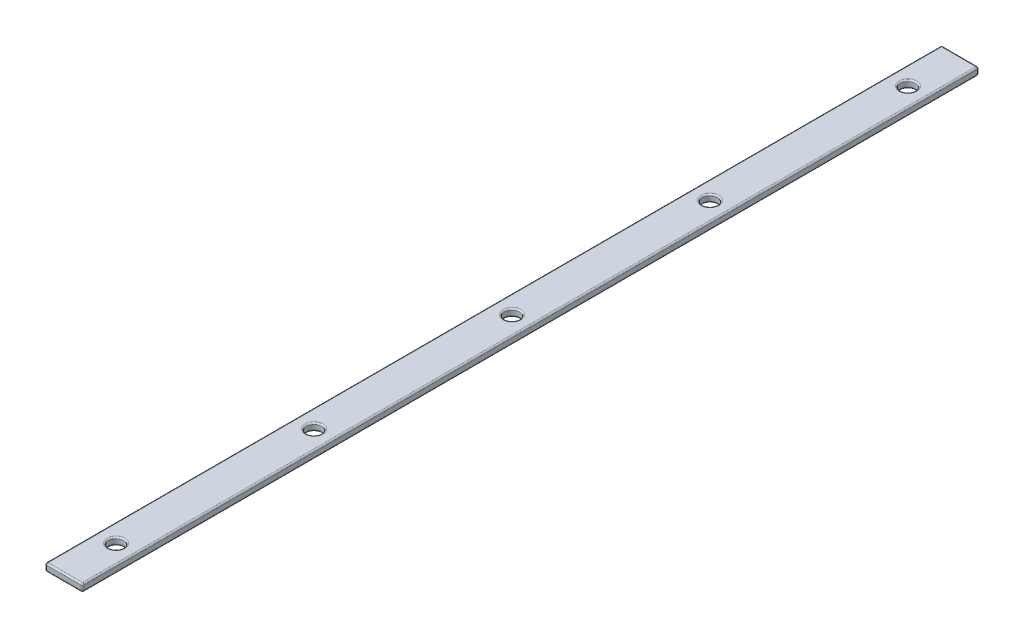
ISO-10303-21;
HEADER;
FILE_DESCRIPTION(('STEP AP214'),'2;1');
FILE_NAME('part.step','',(''),(''),'','','');
FILE_SCHEMA(('AUTOMOTIVE_DESIGN { 1 0 10303 214 1 1 1 1 }'));
ENDSEC;
DATA;
#1=APPLICATION_CONTEXT('core data for automotive mechanical design processes');
#2=APPLICATION_PROTOCOL_DEFINITION('international standard','automotive_design',2000,#1);
#3=PRODUCT_CONTEXT('',#1,'mechanical');
#4=PRODUCT('Part','Part','',(#3));
#5=PRODUCT_RELATED_PRODUCT_CATEGORY('part','',(#4));
#6=PRODUCT_DEFINITION_FORMATION('','',#4);
#7=PRODUCT_DEFINITION_CONTEXT('part definition',#1,'design');
#8=PRODUCT_DEFINITION('design','',#6,#7);
#9=PRODUCT_DEFINITION_SHAPE('','',#8);
#10=(LENGTH_UNIT() NAMED_UNIT(*) SI_UNIT(.MILLI.,.METRE.));
#11=(NAMED_UNIT(*) PLANE_ANGLE_UNIT() SI_UNIT($,.RADIAN.));
#12=(NAMED_UNIT(*) SI_UNIT($,.STERADIAN.) SOLID_ANGLE_UNIT());
#13=UNCERTAINTY_MEASURE_WITH_UNIT(LENGTH_MEASURE(1.E-05),#10,'distance_accuracy_value','');
#14=(GEOMETRIC_REPRESENTATION_CONTEXT(3) GLOBAL_UNCERTAINTY_ASSIGNED_CONTEXT((#13)) GLOBAL_UNIT_ASSIGNED_CONTEXT((#10,
#11,#12)) REPRESENTATION_CONTEXT('',''));
#15=CARTESIAN_POINT('',(0.,0.,0.));
#16=DIRECTION('',(0.,0.,1.));
#17=DIRECTION('',(1.,0.,0.));
#18=AXIS2_PLACEMENT_3D('',#15,#16,#17);
#19=CARTESIAN_POINT('',(0.,10.,0.));
#20=DIRECTION('',(0.,-1.,0.));
#21=DIRECTION('',(0.,0.,-1.));
#22=AXIS2_PLACEMENT_3D('',#19,#20,#21);
#23=PLANE('',#22);
#24=CARTESIAN_POINT('',(0.,10.,530.));
#25=DIRECTION('',(0.,-1.,0.));
#26=DIRECTION('',(0.,0.,-1.));
#27=AXIS2_PLACEMENT_3D('',#24,#25,#26);
#28=CIRCLE('',#27,12.);
#29=CARTESIAN_POINT('',(0.,10.,518.));
#30=VERTEX_POINT('',#29);
#31=EDGE_CURVE('E184',#30,#30,#28,.T.);
#32=ORIENTED_EDGE('',*,*,#31,.T.);
#33=EDGE_LOOP('',(#32));
#34=FACE_BOUND('',#33,.T.);
#35=CARTESIAN_POINT('',(0.,10.,265.));
#36=DIRECTION('',(0.,-1.,0.));
#37=DIRECTION('',(0.,0.,-1.));
#38=AXIS2_PLACEMENT_3D('',#35,#36,#37);
#39=CIRCLE('',#38,12.);
#40=CARTESIAN_POINT('',(0.,10.,253.));
#41=VERTEX_POINT('',#40);
#42=EDGE_CURVE('E181',#41,#41,#39,.T.);
#43=ORIENTED_EDGE('',*,*,#42,.T.);
#44=EDGE_LOOP('',(#43));
#45=FACE_BOUND('',#44,.T.);
#46=CARTESIAN_POINT('',(0.,10.,-530.));
#47=DIRECTION('',(0.,-1.,0.));
#48=DIRECTION('',(0.,0.,-1.));
#49=AXIS2_PLACEMENT_3D('',#46,#47,#48);
#50=CIRCLE('',#49,12.);
#51=CARTESIAN_POINT('',(0.,10.,-542.));
#52=VERTEX_POINT('',#51);
#53=EDGE_CURVE('E178',#52,#52,#50,.T.);
#54=ORIENTED_EDGE('',*,*,#53,.T.);
#55=EDGE_LOOP('',(#54));
#56=FACE_BOUND('',#55,.T.);
#57=CARTESIAN_POINT('',(0.,10.,0.));
#58=DIRECTION('',(0.,-1.,0.));
#59=DIRECTION('',(0.,0.,-1.));
#60=AXIS2_PLACEMENT_3D('',#57,#58,#59);
#61=CIRCLE('',#60,12.);
#62=CARTESIAN_POINT('',(0.,10.,-12.));
#63=VERTEX_POINT('',#62);
#64=EDGE_CURVE('E171',#63,#63,#61,.T.);
#65=ORIENTED_EDGE('',*,*,#64,.T.);
#66=EDGE_LOOP('',(#65));
#67=FACE_BOUND('',#66,.T.);
#68=CARTESIAN_POINT('',(0.,10.,-265.));
#69=DIRECTION('',(0.,-1.,0.));
#70=DIRECTION('',(0.,0.,-1.));
#71=AXIS2_PLACEMENT_3D('',#68,#69,#70);
#72=CIRCLE('',#71,12.);
#73=CARTESIAN_POINT('',(0.,10.,-277.));
#74=VERTEX_POINT('',#73);
#75=EDGE_CURVE('E168',#74,#74,#72,.T.);
#76=ORIENTED_EDGE('',*,*,#75,.T.);
#77=EDGE_LOOP('',(#76));
#78=FACE_BOUND('',#77,.T.);
#79=DIRECTION('',(0.,0.,1.));
#80=VECTOR('',#79,1.);
#81=CARTESIAN_POINT('',(-23.,10.,0.));
#82=LINE('',#81,#80);
#83=CARTESIAN_POINT('',(-23.,10.,-598.));
#84=VERTEX_POINT('',#83);
#85=CARTESIAN_POINT('',(-23.,10.,598.));
#86=VERTEX_POINT('',#85);
#87=EDGE_CURVE('E167',#84,#86,#82,.T.);
#88=ORIENTED_EDGE('',*,*,#87,.T.);
#89=DIRECTION('',(1.,0.,0.));
#90=VECTOR('',#89,1.);
#91=CARTESIAN_POINT('',(0.,10.,598.));
#92=LINE('',#91,#90);
#93=CARTESIAN_POINT('',(23.,10.,598.));
#94=VERTEX_POINT('',#93);
#95=EDGE_CURVE('E147',#86,#94,#92,.T.);
#96=ORIENTED_EDGE('',*,*,#95,.T.);
#97=DIRECTION('',(0.,0.,-1.));
#98=VECTOR('',#97,1.);
#99=CARTESIAN_POINT('',(23.,10.,0.));
#100=LINE('',#99,#98);
#101=CARTESIAN_POINT('',(23.,10.,-598.));
#102=VERTEX_POINT('',#101);
#103=EDGE_CURVE('E156',#94,#102,#100,.T.);
#104=ORIENTED_EDGE('',*,*,#103,.T.);
#105=DIRECTION('',(-1.,0.,0.));
#106=VECTOR('',#105,1.);
#107=CARTESIAN_POINT('',(0.,10.,-598.));
#108=LINE('',#107,#106);
#109=EDGE_CURVE('E162',#102,#84,#108,.T.);
#110=ORIENTED_EDGE('',*,*,#109,.T.);
#111=EDGE_LOOP('',(#88,#96,#104,#110));
#112=FACE_BOUND('',#111,.T.);
#113=ADVANCED_FACE('F37',(#34,#45,#56,#67,#78,#112),#23,.F.);
#114=CARTESIAN_POINT('',(0.,0.,0.));
#115=DIRECTION('',(0.,-1.,0.));
#116=DIRECTION('',(0.,0.,-1.));
#117=AXIS2_PLACEMENT_3D('',#114,#115,#116);
#118=PLANE('',#117);
#119=CARTESIAN_POINT('',(0.,0.,530.));
#120=DIRECTION('',(0.,-1.,0.));
#121=DIRECTION('',(0.,0.,-1.));
#122=AXIS2_PLACEMENT_3D('',#119,#120,#121);
#123=CIRCLE('',#122,12.);
#124=CARTESIAN_POINT('',(0.,0.,518.));
#125=VERTEX_POINT('',#124);
#126=EDGE_CURVE('E152',#125,#125,#123,.F.);
#127=ORIENTED_EDGE('',*,*,#126,.T.);
#128=EDGE_LOOP('',(#127));
#129=FACE_BOUND('',#128,.T.);
#130=CARTESIAN_POINT('',(0.,0.,-530.));
#131=DIRECTION('',(0.,-1.,0.));
#132=DIRECTION('',(0.,0.,-1.));
#133=AXIS2_PLACEMENT_3D('',#130,#131,#132);
#134=CIRCLE('',#133,12.);
#135=CARTESIAN_POINT('',(0.,0.,-542.));
#136=VERTEX_POINT('',#135);
#137=EDGE_CURVE('E251',#136,#136,#134,.F.);
#138=ORIENTED_EDGE('',*,*,#137,.T.);
#139=EDGE_LOOP('',(#138));
#140=FACE_BOUND('',#139,.T.);
#141=CARTESIAN_POINT('',(0.,0.,-265.));
#142=DIRECTION('',(0.,-1.,0.));
#143=DIRECTION('',(0.,0.,-1.));
#144=AXIS2_PLACEMENT_3D('',#141,#142,#143);
#145=CIRCLE('',#144,12.);
#146=CARTESIAN_POINT('',(0.,0.,-277.));
#147=VERTEX_POINT('',#146);
#148=EDGE_CURVE('E248',#147,#147,#145,.F.);
#149=ORIENTED_EDGE('',*,*,#148,.T.);
#150=EDGE_LOOP('',(#149));
#151=FACE_BOUND('',#150,.T.);
#152=DIRECTION('',(0.,0.,1.));
#153=VECTOR('',#152,1.);
#154=CARTESIAN_POINT('',(-23.,0.,-600.));
#155=LINE('',#154,#153);
#156=CARTESIAN_POINT('',(-23.,0.,598.));
#157=VERTEX_POINT('',#156);
#158=CARTESIAN_POINT('',(-23.,0.,-598.));
#159=VERTEX_POINT('',#158);
#160=EDGE_CURVE('E242',#157,#159,#155,.F.);
#161=ORIENTED_EDGE('',*,*,#160,.T.);
#162=DIRECTION('',(-1.,0.,0.));
#163=VECTOR('',#162,1.);
#164=CARTESIAN_POINT('',(25.,0.,-598.));
#165=LINE('',#164,#163);
#166=CARTESIAN_POINT('',(23.,0.,-598.));
#167=VERTEX_POINT('',#166);
#168=EDGE_CURVE('E245',#159,#167,#165,.F.);
#169=ORIENTED_EDGE('',*,*,#168,.T.);
#170=DIRECTION('',(0.,0.,-1.));
#171=VECTOR('',#170,1.);
#172=CARTESIAN_POINT('',(23.,0.,600.));
#173=LINE('',#172,#171);
#174=CARTESIAN_POINT('',(23.,0.,598.));
#175=VERTEX_POINT('',#174);
#176=EDGE_CURVE('E236',#167,#175,#173,.F.);
#177=ORIENTED_EDGE('',*,*,#176,.T.);
#178=DIRECTION('',(1.,0.,0.));
#179=VECTOR('',#178,1.);
#180=CARTESIAN_POINT('',(-25.,0.,598.));
#181=LINE('',#180,#179);
#182=EDGE_CURVE('E239',#175,#157,#181,.F.);
#183=ORIENTED_EDGE('',*,*,#182,.T.);
#184=EDGE_LOOP('',(#161,#169,#177,#183));
#185=FACE_BOUND('',#184,.T.);
#186=CARTESIAN_POINT('',(0.,0.,0.));
#187=DIRECTION('',(0.,-1.,0.));
#188=DIRECTION('',(0.,0.,-1.));
#189=AXIS2_PLACEMENT_3D('',#186,#187,#188);
#190=CIRCLE('',#189,12.);
#191=CARTESIAN_POINT('',(0.,0.,-12.));
#192=VERTEX_POINT('',#191);
#193=EDGE_CURVE('E233',#192,#192,#190,.F.);
#194=ORIENTED_EDGE('',*,*,#193,.T.);
#195=EDGE_LOOP('',(#194));
#196=FACE_BOUND('',#195,.T.);
#197=CARTESIAN_POINT('',(0.,0.,265.));
#198=DIRECTION('',(0.,-1.,0.));
#199=DIRECTION('',(0.,0.,-1.));
#200=AXIS2_PLACEMENT_3D('',#197,#198,#199);
#201=CIRCLE('',#200,12.);
#202=CARTESIAN_POINT('',(0.,0.,253.));
#203=VERTEX_POINT('',#202);
#204=EDGE_CURVE('E230',#203,#203,#201,.F.);
#205=ORIENTED_EDGE('',*,*,#204,.T.);
#206=EDGE_LOOP('',(#205));
#207=FACE_BOUND('',#206,.T.);
#208=ADVANCED_FACE('F328',(#129,#140,#151,#185,#196,#207),#118,.T.);
#209=CARTESIAN_POINT('',(25.,10.,600.));
#210=DIRECTION('',(-1.,0.,0.));
#211=DIRECTION('',(0.,0.,1.));
#212=AXIS2_PLACEMENT_3D('',#209,#210,#211);
#213=PLANE('',#212);
#214=DIRECTION('',(0.,0.,-1.));
#215=VECTOR('',#214,1.);
#216=CARTESIAN_POINT('',(25.,8.,600.));
#217=LINE('',#216,#215);
#218=CARTESIAN_POINT('',(25.,8.,-598.));
#219=VERTEX_POINT('',#218);
#220=CARTESIAN_POINT('',(25.,8.,598.));
#221=VERTEX_POINT('',#220);
#222=EDGE_CURVE('E228',#219,#221,#217,.F.);
#223=ORIENTED_EDGE('',*,*,#222,.T.);
#224=DIRECTION('',(0.,-1.,0.));
#225=VECTOR('',#224,1.);
#226=CARTESIAN_POINT('',(25.,10.,598.));
#227=LINE('',#226,#225);
#228=CARTESIAN_POINT('',(25.,2.,598.));
#229=VERTEX_POINT('',#228);
#230=EDGE_CURVE('E291',#221,#229,#227,.T.);
#231=ORIENTED_EDGE('',*,*,#230,.T.);
#232=DIRECTION('',(0.,0.,-1.));
#233=VECTOR('',#232,1.);
#234=CARTESIAN_POINT('',(25.,2.,-600.));
#235=LINE('',#234,#233);
#236=CARTESIAN_POINT('',(25.,2.,-598.));
#237=VERTEX_POINT('',#236);
#238=EDGE_CURVE('E225',#229,#237,#235,.T.);
#239=ORIENTED_EDGE('',*,*,#238,.T.);
#240=DIRECTION('',(0.,-1.,0.));
#241=VECTOR('',#240,1.);
#242=CARTESIAN_POINT('',(25.,10.,-598.));
#243=LINE('',#242,#241);
#244=EDGE_CURVE('E289',#237,#219,#243,.F.);
#245=ORIENTED_EDGE('',*,*,#244,.T.);
#246=EDGE_LOOP('',(#223,#231,#239,#245));
#247=FACE_BOUND('',#246,.T.);
#248=ADVANCED_FACE('F386',(#247),#213,.F.);
#249=CARTESIAN_POINT('',(-25.,10.,-600.));
#250=DIRECTION('',(0.,0.,1.));
#251=DIRECTION('',(1.,0.,0.));
#252=AXIS2_PLACEMENT_3D('',#249,#250,#251);
#253=PLANE('',#252);
#254=DIRECTION('',(-1.,0.,0.));
#255=VECTOR('',#254,1.);
#256=CARTESIAN_POINT('',(-25.,8.,-600.));
#257=LINE('',#256,#255);
#258=CARTESIAN_POINT('',(-23.,8.,-600.));
#259=VERTEX_POINT('',#258);
#260=CARTESIAN_POINT('',(23.,8.,-600.));
#261=VERTEX_POINT('',#260);
#262=EDGE_CURVE('E223',#259,#261,#257,.F.);
#263=ORIENTED_EDGE('',*,*,#262,.T.);
#264=DIRECTION('',(0.,-1.,0.));
#265=VECTOR('',#264,1.);
#266=CARTESIAN_POINT('',(23.,10.,-600.));
#267=LINE('',#266,#265);
#268=CARTESIAN_POINT('',(23.,2.,-600.));
#269=VERTEX_POINT('',#268);
#270=EDGE_CURVE('E12',#261,#269,#267,.T.);
#271=ORIENTED_EDGE('',*,*,#270,.T.);
#272=DIRECTION('',(-1.,0.,0.));
#273=VECTOR('',#272,1.);
#274=CARTESIAN_POINT('',(-25.,2.,-600.));
#275=LINE('',#274,#273);
#276=CARTESIAN_POINT('',(-23.,2.,-600.));
#277=VERTEX_POINT('',#276);
#278=EDGE_CURVE('E221',#269,#277,#275,.T.);
#279=ORIENTED_EDGE('',*,*,#278,.T.);
#280=DIRECTION('',(0.,-1.,0.));
#281=VECTOR('',#280,1.);
#282=CARTESIAN_POINT('',(-23.,10.,-600.));
#283=LINE('',#282,#281);
#284=EDGE_CURVE('E46',#277,#259,#283,.F.);
#285=ORIENTED_EDGE('',*,*,#284,.T.);
#286=EDGE_LOOP('',(#263,#271,#279,#285));
#287=FACE_BOUND('',#286,.T.);
#288=ADVANCED_FACE('F398',(#287),#253,.F.);
#289=CARTESIAN_POINT('',(-25.,10.,600.));
#290=DIRECTION('',(1.,0.,0.));
#291=DIRECTION('',(0.,0.,-1.));
#292=AXIS2_PLACEMENT_3D('',#289,#290,#291);
#293=PLANE('',#292);
#294=DIRECTION('',(0.,0.,1.));
#295=VECTOR('',#294,1.);
#296=CARTESIAN_POINT('',(-25.,2.,600.));
#297=LINE('',#296,#295);
#298=CARTESIAN_POINT('',(-25.,2.,-598.));
#299=VERTEX_POINT('',#298);
#300=CARTESIAN_POINT('',(-25.,2.,598.));
#301=VERTEX_POINT('',#300);
#302=EDGE_CURVE('E215',#299,#301,#297,.T.);
#303=ORIENTED_EDGE('',*,*,#302,.T.);
#304=DIRECTION('',(0.,-1.,0.));
#305=VECTOR('',#304,1.);
#306=CARTESIAN_POINT('',(-25.,10.,598.));
#307=LINE('',#306,#305);
#308=CARTESIAN_POINT('',(-25.,8.,598.));
#309=VERTEX_POINT('',#308);
#310=EDGE_CURVE('E287',#301,#309,#307,.F.);
#311=ORIENTED_EDGE('',*,*,#310,.T.);
#312=DIRECTION('',(0.,0.,1.));
#313=VECTOR('',#312,1.);
#314=CARTESIAN_POINT('',(-25.,8.,600.));
#315=LINE('',#314,#313);
#316=CARTESIAN_POINT('',(-25.,8.,-598.));
#317=VERTEX_POINT('',#316);
#318=EDGE_CURVE('E218',#309,#317,#315,.F.);
#319=ORIENTED_EDGE('',*,*,#318,.T.);
#320=DIRECTION('',(0.,-1.,0.));
#321=VECTOR('',#320,1.);
#322=CARTESIAN_POINT('',(-25.,10.,-598.));
#323=LINE('',#322,#321);
#324=EDGE_CURVE('E285',#317,#299,#323,.T.);
#325=ORIENTED_EDGE('',*,*,#324,.T.);
#326=EDGE_LOOP('',(#303,#311,#319,#325));
#327=FACE_BOUND('',#326,.T.);
#328=ADVANCED_FACE('F365',(#327),#293,.F.);
#329=CARTESIAN_POINT('',(-25.,10.,600.));
#330=DIRECTION('',(0.,0.,-1.));
#331=DIRECTION('',(-1.,0.,0.));
#332=AXIS2_PLACEMENT_3D('',#329,#330,#331);
#333=PLANE('',#332);
#334=DIRECTION('',(1.,0.,0.));
#335=VECTOR('',#334,1.);
#336=CARTESIAN_POINT('',(-25.,8.,600.));
#337=LINE('',#336,#335);
#338=CARTESIAN_POINT('',(23.,8.,600.));
#339=VERTEX_POINT('',#338);
#340=CARTESIAN_POINT('',(-23.,8.,600.));
#341=VERTEX_POINT('',#340);
#342=EDGE_CURVE('E150',#339,#341,#337,.F.);
#343=ORIENTED_EDGE('',*,*,#342,.T.);
#344=DIRECTION('',(0.,-1.,0.));
#345=VECTOR('',#344,1.);
#346=CARTESIAN_POINT('',(-23.,10.,600.));
#347=LINE('',#346,#345);
#348=CARTESIAN_POINT('',(-23.,2.,600.));
#349=VERTEX_POINT('',#348);
#350=EDGE_CURVE('E283',#341,#349,#347,.T.);
#351=ORIENTED_EDGE('',*,*,#350,.T.);
#352=DIRECTION('',(1.,0.,0.));
#353=VECTOR('',#352,1.);
#354=CARTESIAN_POINT('',(25.,2.,600.));
#355=LINE('',#354,#353);
#356=CARTESIAN_POINT('',(23.,2.,600.));
#357=VERTEX_POINT('',#356);
#358=EDGE_CURVE('E211',#349,#357,#355,.T.);
#359=ORIENTED_EDGE('',*,*,#358,.T.);
#360=DIRECTION('',(0.,-1.,0.));
#361=VECTOR('',#360,1.);
#362=CARTESIAN_POINT('',(23.,10.,600.));
#363=LINE('',#362,#361);
#364=EDGE_CURVE('E281',#357,#339,#363,.F.);
#365=ORIENTED_EDGE('',*,*,#364,.T.);
#366=EDGE_LOOP('',(#343,#351,#359,#365));
#367=FACE_BOUND('',#366,.T.);
#368=ADVANCED_FACE('F354',(#367),#333,.F.);
#369=CARTESIAN_POINT('',(0.,10.,-265.));
#370=DIRECTION('',(0.,-1.,0.));
#371=DIRECTION('',(0.,0.,-1.));
#372=AXIS2_PLACEMENT_3D('',#369,#370,#371);
#373=CYLINDRICAL_SURFACE('',#372,9.99999999999998);
#374=CARTESIAN_POINT('',(0.,8.,-265.));
#375=DIRECTION('',(0.,-1.,0.));
#376=DIRECTION('',(0.,0.,-1.));
#377=AXIS2_PLACEMENT_3D('',#374,#375,#376);
#378=CIRCLE('',#377,9.99999999999998);
#379=CARTESIAN_POINT('',(0.,8.,-275.));
#380=VERTEX_POINT('',#379);
#381=EDGE_CURVE('E208',#380,#380,#378,.F.);
#382=ORIENTED_EDGE('',*,*,#381,.T.);
#383=EDGE_LOOP('',(#382));
#384=FACE_BOUND('',#383,.T.);
#385=CARTESIAN_POINT('',(0.,2.,-265.));
#386=DIRECTION('',(0.,-1.,0.));
#387=DIRECTION('',(0.,0.,-1.));
#388=AXIS2_PLACEMENT_3D('',#385,#386,#387);
#389=CIRCLE('',#388,9.99999999999998);
#390=CARTESIAN_POINT('',(0.,2.,-275.));
#391=VERTEX_POINT('',#390);
#392=EDGE_CURVE('E205',#391,#391,#389,.T.);
#393=ORIENTED_EDGE('',*,*,#392,.T.);
#394=EDGE_LOOP('',(#393));
#395=FACE_BOUND('',#394,.T.);
#396=ADVANCED_FACE('F391',(#384,#395),#373,.F.);
#397=CARTESIAN_POINT('',(0.,10.,0.));
#398=DIRECTION('',(0.,-1.,0.));
#399=DIRECTION('',(0.,0.,-1.));
#400=AXIS2_PLACEMENT_3D('',#397,#398,#399);
#401=CYLINDRICAL_SURFACE('',#400,10.);
#402=CARTESIAN_POINT('',(0.,8.,0.));
#403=DIRECTION('',(0.,-1.,0.));
#404=DIRECTION('',(0.,0.,-1.));
#405=AXIS2_PLACEMENT_3D('',#402,#403,#404);
#406=CIRCLE('',#405,10.);
#407=CARTESIAN_POINT('',(0.,8.,-9.99999999999997));
#408=VERTEX_POINT('',#407);
#409=EDGE_CURVE('E202',#408,#408,#406,.F.);
#410=ORIENTED_EDGE('',*,*,#409,.T.);
#411=EDGE_LOOP('',(#410));
#412=FACE_BOUND('',#411,.T.);
#413=CARTESIAN_POINT('',(0.,2.,0.));
#414=DIRECTION('',(0.,-1.,0.));
#415=DIRECTION('',(0.,0.,-1.));
#416=AXIS2_PLACEMENT_3D('',#413,#414,#415);
#417=CIRCLE('',#416,10.);
#418=CARTESIAN_POINT('',(0.,2.,-9.99999999999997));
#419=VERTEX_POINT('',#418);
#420=EDGE_CURVE('E199',#419,#419,#417,.T.);
#421=ORIENTED_EDGE('',*,*,#420,.T.);
#422=EDGE_LOOP('',(#421));
#423=FACE_BOUND('',#422,.T.);
#424=ADVANCED_FACE('F481',(#412,#423),#401,.F.);
#425=CARTESIAN_POINT('',(0.,10.,-530.));
#426=DIRECTION('',(0.,-1.,0.));
#427=DIRECTION('',(0.,0.,-1.));
#428=AXIS2_PLACEMENT_3D('',#425,#426,#427);
#429=CYLINDRICAL_SURFACE('',#428,10.);
#430=CARTESIAN_POINT('',(0.,8.,-530.));
#431=DIRECTION('',(0.,-1.,0.));
#432=DIRECTION('',(0.,0.,-1.));
#433=AXIS2_PLACEMENT_3D('',#430,#431,#432);
#434=CIRCLE('',#433,10.);
#435=CARTESIAN_POINT('',(0.,8.,-540.));
#436=VERTEX_POINT('',#435);
#437=EDGE_CURVE('E196',#436,#436,#434,.F.);
#438=ORIENTED_EDGE('',*,*,#437,.T.);
#439=EDGE_LOOP('',(#438));
#440=FACE_BOUND('',#439,.T.);
#441=CARTESIAN_POINT('',(0.,2.,-530.));
#442=DIRECTION('',(0.,-1.,0.));
#443=DIRECTION('',(0.,0.,-1.));
#444=AXIS2_PLACEMENT_3D('',#441,#442,#443);
#445=CIRCLE('',#444,10.);
#446=CARTESIAN_POINT('',(0.,2.,-540.));
#447=VERTEX_POINT('',#446);
#448=EDGE_CURVE('E193',#447,#447,#445,.T.);
#449=ORIENTED_EDGE('',*,*,#448,.T.);
#450=EDGE_LOOP('',(#449));
#451=FACE_BOUND('',#450,.T.);
#452=ADVANCED_FACE('F472',(#440,#451),#429,.F.);
#453=CARTESIAN_POINT('',(0.,10.,265.));
#454=DIRECTION('',(0.,-1.,0.));
#455=DIRECTION('',(0.,0.,-1.));
#456=AXIS2_PLACEMENT_3D('',#453,#454,#455);
#457=CYLINDRICAL_SURFACE('',#456,10.);
#458=CARTESIAN_POINT('',(0.,8.,265.));
#459=DIRECTION('',(0.,-1.,0.));
#460=DIRECTION('',(0.,0.,-1.));
#461=AXIS2_PLACEMENT_3D('',#458,#459,#460);
#462=CIRCLE('',#461,10.);
#463=CARTESIAN_POINT('',(0.,8.,255.));
#464=VERTEX_POINT('',#463);
#465=EDGE_CURVE('E190',#464,#464,#462,.F.);
#466=ORIENTED_EDGE('',*,*,#465,.T.);
#467=EDGE_LOOP('',(#466));
#468=FACE_BOUND('',#467,.T.);
#469=CARTESIAN_POINT('',(0.,2.,265.));
#470=DIRECTION('',(0.,-1.,0.));
#471=DIRECTION('',(0.,0.,-1.));
#472=AXIS2_PLACEMENT_3D('',#469,#470,#471);
#473=CIRCLE('',#472,10.);
#474=CARTESIAN_POINT('',(0.,2.,255.));
#475=VERTEX_POINT('',#474);
#476=EDGE_CURVE('E187',#475,#475,#473,.T.);
#477=ORIENTED_EDGE('',*,*,#476,.T.);
#478=EDGE_LOOP('',(#477));
#479=FACE_BOUND('',#478,.T.);
#480=ADVANCED_FACE('F470',(#468,#479),#457,.F.);
#481=CARTESIAN_POINT('',(0.,10.,530.));
#482=DIRECTION('',(0.,-1.,0.));
#483=DIRECTION('',(0.,0.,-1.));
#484=AXIS2_PLACEMENT_3D('',#481,#482,#483);
#485=CYLINDRICAL_SURFACE('',#484,10.);
#486=CARTESIAN_POINT('',(0.,8.,530.));
#487=DIRECTION('',(0.,-1.,0.));
#488=DIRECTION('',(0.,0.,-1.));
#489=AXIS2_PLACEMENT_3D('',#486,#487,#488);
#490=CIRCLE('',#489,10.);
#491=CARTESIAN_POINT('',(0.,8.,520.));
#492=VERTEX_POINT('',#491);
#493=EDGE_CURVE('E163',#492,#492,#490,.F.);
#494=ORIENTED_EDGE('',*,*,#493,.T.);
#495=EDGE_LOOP('',(#494));
#496=FACE_BOUND('',#495,.T.);
#497=CARTESIAN_POINT('',(0.,2.,530.));
#498=DIRECTION('',(0.,-1.,0.));
#499=DIRECTION('',(0.,0.,-1.));
#500=AXIS2_PLACEMENT_3D('',#497,#498,#499);
#501=CIRCLE('',#500,10.);
#502=CARTESIAN_POINT('',(0.,2.,520.));
#503=VERTEX_POINT('',#502);
#504=EDGE_CURVE('E300',#503,#503,#501,.T.);
#505=ORIENTED_EDGE('',*,*,#504,.T.);
#506=EDGE_LOOP('',(#505));
#507=FACE_BOUND('',#506,.T.);
#508=ADVANCED_FACE('F408',(#496,#507),#485,.F.);
#509=CARTESIAN_POINT('',(0.,8.,530.));
#510=DIRECTION('',(0.,-1.,0.));
#511=DIRECTION('',(0.,0.,-1.));
#512=AXIS2_PLACEMENT_3D('',#509,#510,#511);
#513=TOROIDAL_SURFACE('',#512,12.,2.);
#514=ORIENTED_EDGE('',*,*,#31,.F.);
#515=EDGE_LOOP('',(#514));
#516=FACE_BOUND('',#515,.T.);
#517=ORIENTED_EDGE('',*,*,#493,.F.);
#518=EDGE_LOOP('',(#517));
#519=FACE_BOUND('',#518,.T.);
#520=ADVANCED_FACE('F404',(#516,#519),#513,.T.);
#521=CARTESIAN_POINT('',(0.,8.,265.));
#522=DIRECTION('',(0.,-1.,0.));
#523=DIRECTION('',(0.,0.,-1.));
#524=AXIS2_PLACEMENT_3D('',#521,#522,#523);
#525=TOROIDAL_SURFACE('',#524,12.,2.);
#526=ORIENTED_EDGE('',*,*,#42,.F.);
#527=EDGE_LOOP('',(#526));
#528=FACE_BOUND('',#527,.T.);
#529=ORIENTED_EDGE('',*,*,#465,.F.);
#530=EDGE_LOOP('',(#529));
#531=FACE_BOUND('',#530,.T.);
#532=ADVANCED_FACE('F407',(#528,#531),#525,.T.);
#533=CARTESIAN_POINT('',(0.,8.,-530.));
#534=DIRECTION('',(0.,-1.,0.));
#535=DIRECTION('',(0.,0.,-1.));
#536=AXIS2_PLACEMENT_3D('',#533,#534,#535);
#537=TOROIDAL_SURFACE('',#536,12.,2.);
#538=ORIENTED_EDGE('',*,*,#53,.F.);
#539=EDGE_LOOP('',(#538));
#540=FACE_BOUND('',#539,.T.);
#541=ORIENTED_EDGE('',*,*,#437,.F.);
#542=EDGE_LOOP('',(#541));
#543=FACE_BOUND('',#542,.T.);
#544=ADVANCED_FACE('F412',(#540,#543),#537,.T.);
#545=CARTESIAN_POINT('',(0.,8.,0.));
#546=DIRECTION('',(0.,-1.,0.));
#547=DIRECTION('',(0.,0.,-1.));
#548=AXIS2_PLACEMENT_3D('',#545,#546,#547);
#549=TOROIDAL_SURFACE('',#548,12.,2.);
#550=ORIENTED_EDGE('',*,*,#64,.F.);
#551=EDGE_LOOP('',(#550));
#552=FACE_BOUND('',#551,.T.);
#553=ORIENTED_EDGE('',*,*,#409,.F.);
#554=EDGE_LOOP('',(#553));
#555=FACE_BOUND('',#554,.T.);
#556=ADVANCED_FACE('F416',(#552,#555),#549,.T.);
#557=CARTESIAN_POINT('',(0.,8.,-265.));
#558=DIRECTION('',(0.,-1.,0.));
#559=DIRECTION('',(0.,0.,-1.));
#560=AXIS2_PLACEMENT_3D('',#557,#558,#559);
#561=TOROIDAL_SURFACE('',#560,12.,2.);
#562=ORIENTED_EDGE('',*,*,#75,.F.);
#563=EDGE_LOOP('',(#562));
#564=FACE_BOUND('',#563,.T.);
#565=ORIENTED_EDGE('',*,*,#381,.F.);
#566=EDGE_LOOP('',(#565));
#567=FACE_BOUND('',#566,.T.);
#568=ADVANCED_FACE('F420',(#564,#567),#561,.T.);
#569=CARTESIAN_POINT('',(0.,8.,-598.));
#570=DIRECTION('',(-1.,0.,0.));
#571=DIRECTION('',(0.,0.,1.));
#572=AXIS2_PLACEMENT_3D('',#569,#570,#571);
#573=CYLINDRICAL_SURFACE('',#572,2.);
#574=ORIENTED_EDGE('',*,*,#109,.F.);
#575=CARTESIAN_POINT('',(23.,8.,-598.));
#576=DIRECTION('',(-1.,0.,0.));
#577=DIRECTION('',(0.,0.,1.));
#578=AXIS2_PLACEMENT_3D('',#575,#576,#577);
#579=CIRCLE('',#578,2.);
#580=EDGE_CURVE('E276',#102,#261,#579,.T.);
#581=ORIENTED_EDGE('',*,*,#580,.T.);
#582=ORIENTED_EDGE('',*,*,#262,.F.);
#583=CARTESIAN_POINT('',(-23.,8.,-598.));
#584=DIRECTION('',(-1.,0.,0.));
#585=DIRECTION('',(0.,0.,1.));
#586=AXIS2_PLACEMENT_3D('',#583,#584,#585);
#587=CIRCLE('',#586,2.);
#588=EDGE_CURVE('E274',#259,#84,#587,.F.);
#589=ORIENTED_EDGE('',*,*,#588,.T.);
#590=EDGE_LOOP('',(#574,#581,#582,#589));
#591=FACE_BOUND('',#590,.T.);
#592=ADVANCED_FACE('F424',(#591),#573,.T.);
#593=CARTESIAN_POINT('',(-23.,8.,0.));
#594=DIRECTION('',(0.,0.,1.));
#595=DIRECTION('',(1.,0.,0.));
#596=AXIS2_PLACEMENT_3D('',#593,#594,#595);
#597=CYLINDRICAL_SURFACE('',#596,2.);
#598=ORIENTED_EDGE('',*,*,#318,.F.);
#599=CARTESIAN_POINT('',(-23.,8.,598.));
#600=DIRECTION('',(0.,0.,1.));
#601=DIRECTION('',(1.,0.,0.));
#602=AXIS2_PLACEMENT_3D('',#599,#600,#601);
#603=CIRCLE('',#602,2.);
#604=EDGE_CURVE('E260',#309,#86,#603,.F.);
#605=ORIENTED_EDGE('',*,*,#604,.T.);
#606=ORIENTED_EDGE('',*,*,#87,.F.);
#607=CARTESIAN_POINT('',(-23.,8.,-598.));
#608=DIRECTION('',(0.,0.,1.));
#609=DIRECTION('',(1.,0.,0.));
#610=AXIS2_PLACEMENT_3D('',#607,#608,#609);
#611=CIRCLE('',#610,2.);
#612=EDGE_CURVE('E257',#84,#317,#611,.T.);
#613=ORIENTED_EDGE('',*,*,#612,.T.);
#614=EDGE_LOOP('',(#598,#605,#606,#613));
#615=FACE_BOUND('',#614,.T.);
#616=ADVANCED_FACE('F368',(#615),#597,.T.);
#617=CARTESIAN_POINT('',(23.,8.,0.));
#618=DIRECTION('',(0.,0.,-1.));
#619=DIRECTION('',(-1.,0.,0.));
#620=AXIS2_PLACEMENT_3D('',#617,#618,#619);
#621=CYLINDRICAL_SURFACE('',#620,2.);
#622=ORIENTED_EDGE('',*,*,#103,.F.);
#623=CARTESIAN_POINT('',(23.,8.,598.));
#624=DIRECTION('',(0.,0.,-1.));
#625=DIRECTION('',(-1.,0.,0.));
#626=AXIS2_PLACEMENT_3D('',#623,#624,#625);
#627=CIRCLE('',#626,2.);
#628=EDGE_CURVE('E128',#94,#221,#627,.T.);
#629=ORIENTED_EDGE('',*,*,#628,.T.);
#630=ORIENTED_EDGE('',*,*,#222,.F.);
#631=CARTESIAN_POINT('',(23.,8.,-598.));
#632=DIRECTION('',(0.,0.,-1.));
#633=DIRECTION('',(-1.,0.,0.));
#634=AXIS2_PLACEMENT_3D('',#631,#632,#633);
#635=CIRCLE('',#634,2.);
#636=EDGE_CURVE('E139',#219,#102,#635,.F.);
#637=ORIENTED_EDGE('',*,*,#636,.T.);
#638=EDGE_LOOP('',(#622,#629,#630,#637));
#639=FACE_BOUND('',#638,.T.);
#640=ADVANCED_FACE('F157',(#639),#621,.T.);
#641=CARTESIAN_POINT('',(0.,8.,598.));
#642=DIRECTION('',(1.,0.,0.));
#643=DIRECTION('',(0.,0.,-1.));
#644=AXIS2_PLACEMENT_3D('',#641,#642,#643);
#645=CYLINDRICAL_SURFACE('',#644,2.);
#646=ORIENTED_EDGE('',*,*,#95,.F.);
#647=CARTESIAN_POINT('',(-23.,8.,598.));
#648=DIRECTION('',(1.,0.,0.));
#649=DIRECTION('',(0.,0.,-1.));
#650=AXIS2_PLACEMENT_3D('',#647,#648,#649);
#651=CIRCLE('',#650,2.);
#652=EDGE_CURVE('E151',#86,#341,#651,.T.);
#653=ORIENTED_EDGE('',*,*,#652,.T.);
#654=ORIENTED_EDGE('',*,*,#342,.F.);
#655=CARTESIAN_POINT('',(23.,8.,598.));
#656=DIRECTION('',(1.,0.,0.));
#657=DIRECTION('',(0.,0.,-1.));
#658=AXIS2_PLACEMENT_3D('',#655,#656,#657);
#659=CIRCLE('',#658,2.);
#660=EDGE_CURVE('E131',#339,#94,#659,.F.);
#661=ORIENTED_EDGE('',*,*,#660,.T.);
#662=EDGE_LOOP('',(#646,#653,#654,#661));
#663=FACE_BOUND('',#662,.T.);
#664=ADVANCED_FACE('F144',(#663),#645,.T.);
#665=CARTESIAN_POINT('',(0.,2.,530.));
#666=DIRECTION('',(0.,-1.,0.));
#667=DIRECTION('',(0.,0.,-1.));
#668=AXIS2_PLACEMENT_3D('',#665,#666,#667);
#669=TOROIDAL_SURFACE('',#668,12.,2.);
#670=ORIENTED_EDGE('',*,*,#504,.F.);
#671=EDGE_LOOP('',(#670));
#672=FACE_BOUND('',#671,.T.);
#673=ORIENTED_EDGE('',*,*,#126,.F.);
#674=EDGE_LOOP('',(#673));
#675=FACE_BOUND('',#674,.T.);
#676=ADVANCED_FACE('F428',(#672,#675),#669,.T.);
#677=CARTESIAN_POINT('',(0.,2.,-530.));
#678=DIRECTION('',(0.,-1.,0.));
#679=DIRECTION('',(0.,0.,-1.));
#680=AXIS2_PLACEMENT_3D('',#677,#678,#679);
#681=TOROIDAL_SURFACE('',#680,12.,2.);
#682=ORIENTED_EDGE('',*,*,#448,.F.);
#683=EDGE_LOOP('',(#682));
#684=FACE_BOUND('',#683,.T.);
#685=ORIENTED_EDGE('',*,*,#137,.F.);
#686=EDGE_LOOP('',(#685));
#687=FACE_BOUND('',#686,.T.);
#688=ADVANCED_FACE('F438',(#684,#687),#681,.T.);
#689=CARTESIAN_POINT('',(0.,2.,-265.));
#690=DIRECTION('',(0.,-1.,0.));
#691=DIRECTION('',(0.,0.,-1.));
#692=AXIS2_PLACEMENT_3D('',#689,#690,#691);
#693=TOROIDAL_SURFACE('',#692,12.,2.);
#694=ORIENTED_EDGE('',*,*,#392,.F.);
#695=EDGE_LOOP('',(#694));
#696=FACE_BOUND('',#695,.T.);
#697=ORIENTED_EDGE('',*,*,#148,.F.);
#698=EDGE_LOOP('',(#697));
#699=FACE_BOUND('',#698,.T.);
#700=ADVANCED_FACE('F442',(#696,#699),#693,.T.);
#701=CARTESIAN_POINT('',(-25.,2.,598.));
#702=DIRECTION('',(-1.,0.,0.));
#703=DIRECTION('',(0.,0.,1.));
#704=AXIS2_PLACEMENT_3D('',#701,#702,#703);
#705=CYLINDRICAL_SURFACE('',#704,2.);
#706=ORIENTED_EDGE('',*,*,#358,.F.);
#707=CARTESIAN_POINT('',(-23.,2.,598.));
#708=DIRECTION('',(-1.,0.,0.));
#709=DIRECTION('',(0.,0.,1.));
#710=AXIS2_PLACEMENT_3D('',#707,#708,#709);
#711=CIRCLE('',#710,2.);
#712=EDGE_CURVE('E268',#349,#157,#711,.F.);
#713=ORIENTED_EDGE('',*,*,#712,.T.);
#714=ORIENTED_EDGE('',*,*,#182,.F.);
#715=CARTESIAN_POINT('',(23.,2.,598.));
#716=DIRECTION('',(-1.,0.,0.));
#717=DIRECTION('',(0.,0.,1.));
#718=AXIS2_PLACEMENT_3D('',#715,#716,#717);
#719=CIRCLE('',#718,2.);
#720=EDGE_CURVE('E266',#175,#357,#719,.T.);
#721=ORIENTED_EDGE('',*,*,#720,.T.);
#722=EDGE_LOOP('',(#706,#713,#714,#721));
#723=FACE_BOUND('',#722,.T.);
#724=ADVANCED_FACE('F344',(#723),#705,.T.);
#725=CARTESIAN_POINT('',(23.,2.,600.));
#726=DIRECTION('',(0.,0.,1.));
#727=DIRECTION('',(1.,0.,0.));
#728=AXIS2_PLACEMENT_3D('',#725,#726,#727);
#729=CYLINDRICAL_SURFACE('',#728,2.);
#730=ORIENTED_EDGE('',*,*,#238,.F.);
#731=CARTESIAN_POINT('',(23.,2.,598.));
#732=DIRECTION('',(0.,0.,1.));
#733=DIRECTION('',(1.,0.,0.));
#734=AXIS2_PLACEMENT_3D('',#731,#732,#733);
#735=CIRCLE('',#734,2.);
#736=EDGE_CURVE('E272',#229,#175,#735,.F.);
#737=ORIENTED_EDGE('',*,*,#736,.T.);
#738=ORIENTED_EDGE('',*,*,#176,.F.);
#739=CARTESIAN_POINT('',(23.,2.,-598.));
#740=DIRECTION('',(0.,0.,1.));
#741=DIRECTION('',(1.,0.,0.));
#742=AXIS2_PLACEMENT_3D('',#739,#740,#741);
#743=CIRCLE('',#742,2.);
#744=EDGE_CURVE('E138',#167,#237,#743,.T.);
#745=ORIENTED_EDGE('',*,*,#744,.T.);
#746=EDGE_LOOP('',(#730,#737,#738,#745));
#747=FACE_BOUND('',#746,.T.);
#748=ADVANCED_FACE('F339',(#747),#729,.T.);
#749=CARTESIAN_POINT('',(-23.,2.,600.));
#750=DIRECTION('',(0.,0.,-1.));
#751=DIRECTION('',(-1.,0.,0.));
#752=AXIS2_PLACEMENT_3D('',#749,#750,#751);
#753=CYLINDRICAL_SURFACE('',#752,2.);
#754=ORIENTED_EDGE('',*,*,#160,.F.);
#755=CARTESIAN_POINT('',(-23.,2.,598.));
#756=DIRECTION('',(0.,0.,-1.));
#757=DIRECTION('',(-1.,0.,0.));
#758=AXIS2_PLACEMENT_3D('',#755,#756,#757);
#759=CIRCLE('',#758,2.);
#760=EDGE_CURVE('E264',#157,#301,#759,.T.);
#761=ORIENTED_EDGE('',*,*,#760,.T.);
#762=ORIENTED_EDGE('',*,*,#302,.F.);
#763=CARTESIAN_POINT('',(-23.,2.,-598.));
#764=DIRECTION('',(0.,0.,-1.));
#765=DIRECTION('',(-1.,0.,0.));
#766=AXIS2_PLACEMENT_3D('',#763,#764,#765);
#767=CIRCLE('',#766,2.);
#768=EDGE_CURVE('E262',#299,#159,#767,.F.);
#769=ORIENTED_EDGE('',*,*,#768,.T.);
#770=EDGE_LOOP('',(#754,#761,#762,#769));
#771=FACE_BOUND('',#770,.T.);
#772=ADVANCED_FACE('F325',(#771),#753,.T.);
#773=CARTESIAN_POINT('',(-25.,2.,-598.));
#774=DIRECTION('',(1.,0.,0.));
#775=DIRECTION('',(0.,0.,-1.));
#776=AXIS2_PLACEMENT_3D('',#773,#774,#775);
#777=CYLINDRICAL_SURFACE('',#776,2.);
#778=ORIENTED_EDGE('',*,*,#278,.F.);
#779=CARTESIAN_POINT('',(23.,2.,-598.));
#780=DIRECTION('',(1.,0.,0.));
#781=DIRECTION('',(0.,0.,-1.));
#782=AXIS2_PLACEMENT_3D('',#779,#780,#781);
#783=CIRCLE('',#782,2.);
#784=EDGE_CURVE('E279',#269,#167,#783,.F.);
#785=ORIENTED_EDGE('',*,*,#784,.T.);
#786=ORIENTED_EDGE('',*,*,#168,.F.);
#787=CARTESIAN_POINT('',(-23.,2.,-598.));
#788=DIRECTION('',(1.,0.,0.));
#789=DIRECTION('',(0.,0.,-1.));
#790=AXIS2_PLACEMENT_3D('',#787,#788,#789);
#791=CIRCLE('',#790,2.);
#792=EDGE_CURVE('E54',#159,#277,#791,.T.);
#793=ORIENTED_EDGE('',*,*,#792,.T.);
#794=EDGE_LOOP('',(#778,#785,#786,#793));
#795=FACE_BOUND('',#794,.T.);
#796=ADVANCED_FACE('F332',(#795),#777,.T.);
#797=CARTESIAN_POINT('',(0.,2.,0.));
#798=DIRECTION('',(0.,-1.,0.));
#799=DIRECTION('',(0.,0.,-1.));
#800=AXIS2_PLACEMENT_3D('',#797,#798,#799);
#801=TOROIDAL_SURFACE('',#800,12.,2.);
#802=ORIENTED_EDGE('',*,*,#420,.F.);
#803=EDGE_LOOP('',(#802));
#804=FACE_BOUND('',#803,.T.);
#805=ORIENTED_EDGE('',*,*,#193,.F.);
#806=EDGE_LOOP('',(#805));
#807=FACE_BOUND('',#806,.T.);
#808=ADVANCED_FACE('F449',(#804,#807),#801,.T.);
#809=CARTESIAN_POINT('',(0.,2.,265.));
#810=DIRECTION('',(0.,-1.,0.));
#811=DIRECTION('',(0.,0.,-1.));
#812=AXIS2_PLACEMENT_3D('',#809,#810,#811);
#813=TOROIDAL_SURFACE('',#812,12.,2.);
#814=ORIENTED_EDGE('',*,*,#476,.F.);
#815=EDGE_LOOP('',(#814));
#816=FACE_BOUND('',#815,.T.);
#817=ORIENTED_EDGE('',*,*,#204,.F.);
#818=EDGE_LOOP('',(#817));
#819=FACE_BOUND('',#818,.T.);
#820=ADVANCED_FACE('F457',(#816,#819),#813,.T.);
#821=CARTESIAN_POINT('',(-23.,2.,598.));
#822=DIRECTION('',(0.,0.,1.));
#823=DIRECTION('',(1.,0.,0.));
#824=AXIS2_PLACEMENT_3D('',#821,#822,#823);
#825=SPHERICAL_SURFACE('',#824,2.);
#826=ORIENTED_EDGE('',*,*,#760,.F.);
#827=ORIENTED_EDGE('',*,*,#712,.F.);
#828=CARTESIAN_POINT('',(-23.,2.,598.));
#829=DIRECTION('',(0.,1.,0.));
#830=DIRECTION('',(0.,0.,1.));
#831=AXIS2_PLACEMENT_3D('',#828,#829,#830);
#832=CIRCLE('',#831,2.);
#833=EDGE_CURVE('E296',#301,#349,#832,.T.);
#834=ORIENTED_EDGE('',*,*,#833,.F.);
#835=EDGE_LOOP('',(#826,#827,#834));
#836=FACE_BOUND('',#835,.T.);
#837=ADVANCED_FACE('F358',(#836),#825,.T.);
#838=CARTESIAN_POINT('',(-23.,10.,598.));
#839=DIRECTION('',(0.,-1.,0.));
#840=DIRECTION('',(0.,0.,-1.));
#841=AXIS2_PLACEMENT_3D('',#838,#839,#840);
#842=CYLINDRICAL_SURFACE('',#841,2.);
#843=ORIENTED_EDGE('',*,*,#833,.T.);
#844=ORIENTED_EDGE('',*,*,#350,.F.);
#845=CARTESIAN_POINT('',(-23.,8.,598.));
#846=DIRECTION('',(0.,1.,0.));
#847=DIRECTION('',(0.,0.,1.));
#848=AXIS2_PLACEMENT_3D('',#845,#846,#847);
#849=CIRCLE('',#848,2.);
#850=EDGE_CURVE('E294',#309,#341,#849,.T.);
#851=ORIENTED_EDGE('',*,*,#850,.F.);
#852=ORIENTED_EDGE('',*,*,#310,.F.);
#853=EDGE_LOOP('',(#843,#844,#851,#852));
#854=FACE_BOUND('',#853,.T.);
#855=ADVANCED_FACE('F361',(#854),#842,.T.);
#856=CARTESIAN_POINT('',(-23.,8.,598.));
#857=DIRECTION('',(0.,0.,1.));
#858=DIRECTION('',(1.,0.,0.));
#859=AXIS2_PLACEMENT_3D('',#856,#857,#858);
#860=SPHERICAL_SURFACE('',#859,2.);
#861=ORIENTED_EDGE('',*,*,#652,.F.);
#862=ORIENTED_EDGE('',*,*,#604,.F.);
#863=ORIENTED_EDGE('',*,*,#850,.T.);
#864=EDGE_LOOP('',(#861,#862,#863));
#865=FACE_BOUND('',#864,.T.);
#866=ADVANCED_FACE('F370',(#865),#860,.T.);
#867=CARTESIAN_POINT('',(23.,2.,598.));
#868=DIRECTION('',(0.,0.,1.));
#869=DIRECTION('',(1.,0.,0.));
#870=AXIS2_PLACEMENT_3D('',#867,#868,#869);
#871=SPHERICAL_SURFACE('',#870,2.);
#872=ORIENTED_EDGE('',*,*,#720,.F.);
#873=ORIENTED_EDGE('',*,*,#736,.F.);
#874=CARTESIAN_POINT('',(23.,2.,598.));
#875=DIRECTION('',(0.,1.,0.));
#876=DIRECTION('',(0.,0.,1.));
#877=AXIS2_PLACEMENT_3D('',#874,#875,#876);
#878=CIRCLE('',#877,2.);
#879=EDGE_CURVE('E297',#357,#229,#878,.T.);
#880=ORIENTED_EDGE('',*,*,#879,.F.);
#881=EDGE_LOOP('',(#872,#873,#880));
#882=FACE_BOUND('',#881,.T.);
#883=ADVANCED_FACE('F348',(#882),#871,.T.);
#884=CARTESIAN_POINT('',(23.,10.,598.));
#885=DIRECTION('',(0.,-1.,0.));
#886=DIRECTION('',(0.,0.,-1.));
#887=AXIS2_PLACEMENT_3D('',#884,#885,#886);
#888=CYLINDRICAL_SURFACE('',#887,2.);
#889=ORIENTED_EDGE('',*,*,#879,.T.);
#890=ORIENTED_EDGE('',*,*,#230,.F.);
#891=CARTESIAN_POINT('',(23.,8.,598.));
#892=DIRECTION('',(0.,1.,0.));
#893=DIRECTION('',(0.,0.,1.));
#894=AXIS2_PLACEMENT_3D('',#891,#892,#893);
#895=CIRCLE('',#894,2.);
#896=EDGE_CURVE('E133',#339,#221,#895,.T.);
#897=ORIENTED_EDGE('',*,*,#896,.F.);
#898=ORIENTED_EDGE('',*,*,#364,.F.);
#899=EDGE_LOOP('',(#889,#890,#897,#898));
#900=FACE_BOUND('',#899,.T.);
#901=ADVANCED_FACE('F352',(#900),#888,.T.);
#902=CARTESIAN_POINT('',(23.,8.,598.));
#903=DIRECTION('',(0.,0.,1.));
#904=DIRECTION('',(1.,0.,0.));
#905=AXIS2_PLACEMENT_3D('',#902,#903,#904);
#906=SPHERICAL_SURFACE('',#905,2.);
#907=ORIENTED_EDGE('',*,*,#896,.T.);
#908=ORIENTED_EDGE('',*,*,#628,.F.);
#909=ORIENTED_EDGE('',*,*,#660,.F.);
#910=EDGE_LOOP('',(#907,#908,#909));
#911=FACE_BOUND('',#910,.T.);
#912=ADVANCED_FACE('F130',(#911),#906,.T.);
#913=CARTESIAN_POINT('',(23.,2.,-598.));
#914=DIRECTION('',(0.,0.,1.));
#915=DIRECTION('',(1.,0.,0.));
#916=AXIS2_PLACEMENT_3D('',#913,#914,#915);
#917=SPHERICAL_SURFACE('',#916,2.);
#918=ORIENTED_EDGE('',*,*,#744,.F.);
#919=ORIENTED_EDGE('',*,*,#784,.F.);
#920=CARTESIAN_POINT('',(23.,2.,-598.));
#921=DIRECTION('',(0.,1.,0.));
#922=DIRECTION('',(0.,0.,1.));
#923=AXIS2_PLACEMENT_3D('',#920,#921,#922);
#924=CIRCLE('',#923,2.);
#925=EDGE_CURVE('E302',#237,#269,#924,.T.);
#926=ORIENTED_EDGE('',*,*,#925,.F.);
#927=EDGE_LOOP('',(#918,#919,#926));
#928=FACE_BOUND('',#927,.T.);
#929=ADVANCED_FACE('F701',(#928),#917,.T.);
#930=CARTESIAN_POINT('',(23.,10.,-598.));
#931=DIRECTION('',(0.,-1.,0.));
#932=DIRECTION('',(0.,0.,-1.));
#933=AXIS2_PLACEMENT_3D('',#930,#931,#932);
#934=CYLINDRICAL_SURFACE('',#933,2.);
#935=ORIENTED_EDGE('',*,*,#925,.T.);
#936=ORIENTED_EDGE('',*,*,#270,.F.);
#937=CARTESIAN_POINT('',(23.,8.,-598.));
#938=DIRECTION('',(0.,1.,0.));
#939=DIRECTION('',(0.,0.,1.));
#940=AXIS2_PLACEMENT_3D('',#937,#938,#939);
#941=CIRCLE('',#940,2.);
#942=EDGE_CURVE('E305',#219,#261,#941,.T.);
#943=ORIENTED_EDGE('',*,*,#942,.F.);
#944=ORIENTED_EDGE('',*,*,#244,.F.);
#945=EDGE_LOOP('',(#935,#936,#943,#944));
#946=FACE_BOUND('',#945,.T.);
#947=ADVANCED_FACE('F711',(#946),#934,.T.);
#948=CARTESIAN_POINT('',(23.,8.,-598.));
#949=DIRECTION('',(0.,0.,1.));
#950=DIRECTION('',(1.,0.,0.));
#951=AXIS2_PLACEMENT_3D('',#948,#949,#950);
#952=SPHERICAL_SURFACE('',#951,2.);
#953=ORIENTED_EDGE('',*,*,#942,.T.);
#954=ORIENTED_EDGE('',*,*,#580,.F.);
#955=ORIENTED_EDGE('',*,*,#636,.F.);
#956=EDGE_LOOP('',(#953,#954,#955));
#957=FACE_BOUND('',#956,.T.);
#958=ADVANCED_FACE('F721',(#957),#952,.T.);
#959=CARTESIAN_POINT('',(-23.,2.,-598.));
#960=DIRECTION('',(0.,0.,1.));
#961=DIRECTION('',(1.,0.,0.));
#962=AXIS2_PLACEMENT_3D('',#959,#960,#961);
#963=SPHERICAL_SURFACE('',#962,2.);
#964=ORIENTED_EDGE('',*,*,#792,.F.);
#965=ORIENTED_EDGE('',*,*,#768,.F.);
#966=CARTESIAN_POINT('',(-23.,2.,-598.));
#967=DIRECTION('',(0.,1.,0.));
#968=DIRECTION('',(0.,0.,1.));
#969=AXIS2_PLACEMENT_3D('',#966,#967,#968);
#970=CIRCLE('',#969,2.);
#971=EDGE_CURVE('E41',#277,#299,#970,.T.);
#972=ORIENTED_EDGE('',*,*,#971,.F.);
#973=EDGE_LOOP('',(#964,#965,#972));
#974=FACE_BOUND('',#973,.T.);
#975=ADVANCED_FACE('F39',(#974),#963,.T.);
#976=CARTESIAN_POINT('',(-23.,10.,-598.));
#977=DIRECTION('',(0.,-1.,0.));
#978=DIRECTION('',(0.,0.,-1.));
#979=AXIS2_PLACEMENT_3D('',#976,#977,#978);
#980=CYLINDRICAL_SURFACE('',#979,2.);
#981=ORIENTED_EDGE('',*,*,#971,.T.);
#982=ORIENTED_EDGE('',*,*,#324,.F.);
#983=CARTESIAN_POINT('',(-23.,8.,-598.));
#984=DIRECTION('',(0.,1.,0.));
#985=DIRECTION('',(0.,0.,1.));
#986=AXIS2_PLACEMENT_3D('',#983,#984,#985);
#987=CIRCLE('',#986,2.);
#988=EDGE_CURVE('E309',#259,#317,#987,.T.);
#989=ORIENTED_EDGE('',*,*,#988,.F.);
#990=ORIENTED_EDGE('',*,*,#284,.F.);
#991=EDGE_LOOP('',(#981,#982,#989,#990));
#992=FACE_BOUND('',#991,.T.);
#993=ADVANCED_FACE('F319',(#992),#980,.T.);
#994=CARTESIAN_POINT('',(-23.,8.,-598.));
#995=DIRECTION('',(0.,0.,1.));
#996=DIRECTION('',(1.,0.,0.));
#997=AXIS2_PLACEMENT_3D('',#994,#995,#996);
#998=SPHERICAL_SURFACE('',#997,2.);
#999=ORIENTED_EDGE('',*,*,#612,.F.);
#1000=ORIENTED_EDGE('',*,*,#588,.F.);
#1001=ORIENTED_EDGE('',*,*,#988,.T.);
#1002=EDGE_LOOP('',(#999,#1000,#1001));
#1003=FACE_BOUND('',#1002,.T.);
#1004=ADVANCED_FACE('F749',(#1003),#998,.T.);
#1005=CLOSED_SHELL('',(#113,#208,#248,#288,#328,#368,#396,#424,#452,#480,#508,#520,#532,#544,
#556,#568,#592,#616,#640,#664,#676,#688,#700,#724,#748,#772,#796,#808,#820,#837,#855,#866,#883,
#901,#912,#929,#947,#958,#975,#993,#1004));
#1006=MANIFOLD_SOLID_BREP('B2',#1005);
#1007=ADVANCED_BREP_SHAPE_REPRESENTATION('',(#18,#1006),#14);
#1008=SHAPE_DEFINITION_REPRESENTATION(#9,#1007);
ENDSEC;
END-ISO-10303-21;
